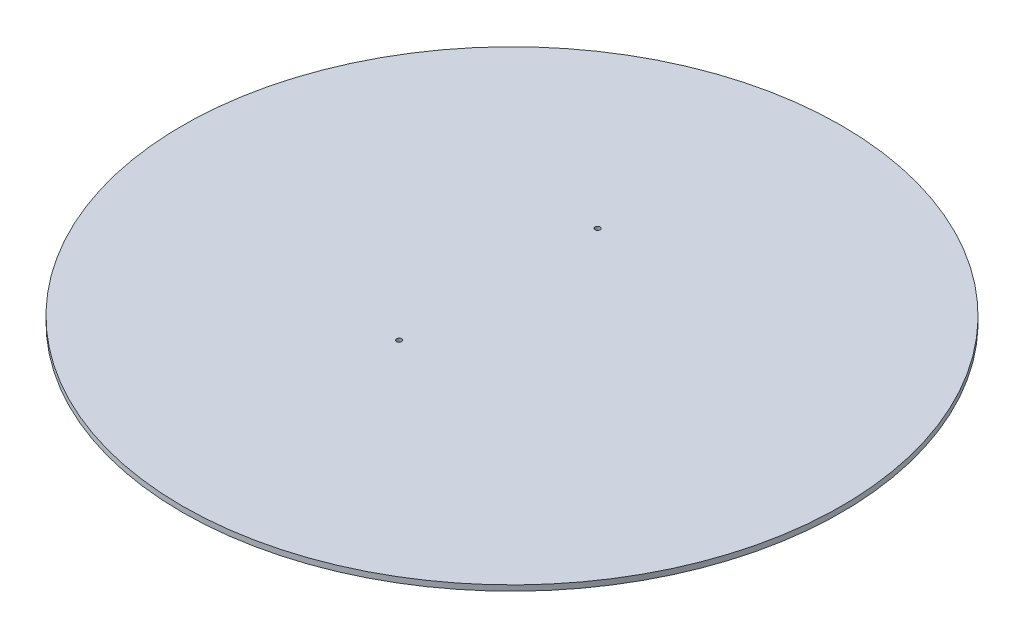
ISO-10303-21;
HEADER;
FILE_DESCRIPTION(('STEP AP214'),'2;1');
FILE_NAME('part.step','',(''),(''),'','','');
FILE_SCHEMA(('AUTOMOTIVE_DESIGN { 1 0 10303 214 1 1 1 1 }'));
ENDSEC;
DATA;
#1=APPLICATION_CONTEXT('core data for automotive mechanical design processes');
#2=APPLICATION_PROTOCOL_DEFINITION('international standard','automotive_design',2000,#1);
#3=PRODUCT_CONTEXT('',#1,'mechanical');
#4=PRODUCT('Part','Part','',(#3));
#5=PRODUCT_RELATED_PRODUCT_CATEGORY('part','',(#4));
#6=PRODUCT_DEFINITION_FORMATION('','',#4);
#7=PRODUCT_DEFINITION_CONTEXT('part definition',#1,'design');
#8=PRODUCT_DEFINITION('design','',#6,#7);
#9=PRODUCT_DEFINITION_SHAPE('','',#8);
#10=(LENGTH_UNIT() NAMED_UNIT(*) SI_UNIT(.MILLI.,.METRE.));
#11=(NAMED_UNIT(*) PLANE_ANGLE_UNIT() SI_UNIT($,.RADIAN.));
#12=(NAMED_UNIT(*) SI_UNIT($,.STERADIAN.) SOLID_ANGLE_UNIT());
#13=UNCERTAINTY_MEASURE_WITH_UNIT(LENGTH_MEASURE(1.E-05),#10,'distance_accuracy_value','');
#14=(GEOMETRIC_REPRESENTATION_CONTEXT(3) GLOBAL_UNCERTAINTY_ASSIGNED_CONTEXT((#13)) GLOBAL_UNIT_ASSIGNED_CONTEXT((#10,
#11,#12)) REPRESENTATION_CONTEXT('',''));
#15=CARTESIAN_POINT('',(0.,0.,0.));
#16=DIRECTION('',(0.,0.,1.));
#17=DIRECTION('',(1.,0.,0.));
#18=AXIS2_PLACEMENT_3D('',#15,#16,#17);
#19=CARTESIAN_POINT('',(0.,5.08,0.));
#20=DIRECTION('',(0.,-1.,0.));
#21=DIRECTION('',(0.,0.,-1.));
#22=AXIS2_PLACEMENT_3D('',#19,#20,#21);
#23=CYLINDRICAL_SURFACE('',#22,304.8);
#24=CARTESIAN_POINT('',(0.,5.08,0.));
#25=DIRECTION('',(0.,1.,0.));
#26=DIRECTION('',(0.,0.,1.));
#27=AXIS2_PLACEMENT_3D('',#24,#25,#26);
#28=CIRCLE('',#27,304.8);
#29=CARTESIAN_POINT('',(0.,5.08,304.8));
#30=VERTEX_POINT('',#29);
#31=EDGE_CURVE('E10',#30,#30,#28,.T.);
#32=ORIENTED_EDGE('',*,*,#31,.F.);
#33=EDGE_LOOP('',(#32));
#34=FACE_BOUND('',#33,.T.);
#35=CARTESIAN_POINT('',(0.,0.,0.));
#36=DIRECTION('',(0.,1.,0.));
#37=DIRECTION('',(0.,0.,1.));
#38=AXIS2_PLACEMENT_3D('',#35,#36,#37);
#39=CIRCLE('',#38,304.8);
#40=CARTESIAN_POINT('',(0.,0.,304.8));
#41=VERTEX_POINT('',#40);
#42=EDGE_CURVE('E44',#41,#41,#39,.T.);
#43=ORIENTED_EDGE('',*,*,#42,.T.);
#44=EDGE_LOOP('',(#43));
#45=FACE_BOUND('',#44,.T.);
#46=ADVANCED_FACE('F37',(#34,#45),#23,.T.);
#47=CARTESIAN_POINT('',(0.,5.08,0.));
#48=DIRECTION('',(0.,1.,0.));
#49=DIRECTION('',(0.,0.,1.));
#50=AXIS2_PLACEMENT_3D('',#47,#48,#49);
#51=PLANE('',#50);
#52=CARTESIAN_POINT('',(-32.706068379434,5.08,71.7460085753199));
#53=DIRECTION('',(0.,1.,0.));
#54=DIRECTION('',(0.959051401440909,0.,0.283232076916137));
#55=AXIS2_PLACEMENT_3D('',#52,#53,#54);
#56=ELLIPSE('',#55,2.3645262104519,2.34949999999998);
#57=CARTESIAN_POINT('',(-30.4383662035564,5.08,72.4157182448289));
#58=VERTEX_POINT('',#57);
#59=EDGE_CURVE('E49',#58,#58,#56,.T.);
#60=ORIENTED_EDGE('',*,*,#59,.F.);
#61=EDGE_LOOP('',(#60));
#62=FACE_BOUND('',#61,.T.);
#63=CARTESIAN_POINT('',(-30.4760806872812,5.08,-109.679755502596));
#64=DIRECTION('',(0.,1.,0.));
#65=DIRECTION('',(0.959051401440909,0.,0.283232076916137));
#66=AXIS2_PLACEMENT_3D('',#63,#64,#65);
#67=ELLIPSE('',#66,2.36452621045189,2.34949999999998);
#68=CARTESIAN_POINT('',(-28.2083785114035,5.08,-109.010045833088));
#69=VERTEX_POINT('',#68);
#70=EDGE_CURVE('E55',#69,#69,#67,.T.);
#71=ORIENTED_EDGE('',*,*,#70,.F.);
#72=EDGE_LOOP('',(#71));
#73=FACE_BOUND('',#72,.T.);
#74=ORIENTED_EDGE('',*,*,#31,.T.);
#75=EDGE_LOOP('',(#74));
#76=FACE_BOUND('',#75,.T.);
#77=ADVANCED_FACE('F70',(#62,#73,#76),#51,.T.);
#78=CARTESIAN_POINT('',(0.,0.,0.));
#79=DIRECTION('',(0.,1.,0.));
#80=DIRECTION('',(0.,0.,1.));
#81=AXIS2_PLACEMENT_3D('',#78,#79,#80);
#82=PLANE('',#81);
#83=CARTESIAN_POINT('',(-33.2579562856185,0.,71.5830221517991));
#84=DIRECTION('',(0.,1.,0.));
#85=DIRECTION('',(0.959051401440909,0.,0.283232076916137));
#86=AXIS2_PLACEMENT_3D('',#83,#84,#85);
#87=ELLIPSE('',#86,2.3645262104519,2.34949999999998);
#88=CARTESIAN_POINT('',(-30.9902541097408,0.,72.252731821308));
#89=VERTEX_POINT('',#88);
#90=EDGE_CURVE('E40',#89,#89,#87,.T.);
#91=ORIENTED_EDGE('',*,*,#90,.T.);
#92=EDGE_LOOP('',(#91));
#93=FACE_BOUND('',#92,.T.);
#94=CARTESIAN_POINT('',(-31.0279685934657,0.,-109.842741926117));
#95=DIRECTION('',(0.,1.,0.));
#96=DIRECTION('',(0.959051401440909,0.,0.283232076916137));
#97=AXIS2_PLACEMENT_3D('',#94,#95,#96);
#98=ELLIPSE('',#97,2.36452621045189,2.34949999999998);
#99=CARTESIAN_POINT('',(-28.760266417588,0.,-109.173032256608));
#100=VERTEX_POINT('',#99);
#101=EDGE_CURVE('E53',#100,#100,#98,.T.);
#102=ORIENTED_EDGE('',*,*,#101,.T.);
#103=EDGE_LOOP('',(#102));
#104=FACE_BOUND('',#103,.T.);
#105=ORIENTED_EDGE('',*,*,#42,.F.);
#106=EDGE_LOOP('',(#105));
#107=FACE_BOUND('',#106,.T.);
#108=ADVANCED_FACE('F73',(#93,#104,#107),#82,.F.);
#109=CARTESIAN_POINT('',(-34.8891578823114,-35.5413506393817,-110.983048545766));
#110=DIRECTION('',(0.10794896477867,0.99364514955026,0.0318800529870175));
#111=DIRECTION('',(-0.994150474320324,0.108003862934042,0.));
#112=AXIS2_PLACEMENT_3D('',#109,#110,#111);
#113=CYLINDRICAL_SURFACE('',#112,2.34949999999998);
#114=ORIENTED_EDGE('',*,*,#70,.T.);
#115=EDGE_LOOP('',(#114));
#116=FACE_BOUND('',#115,.T.);
#117=ORIENTED_EDGE('',*,*,#101,.F.);
#118=EDGE_LOOP('',(#117));
#119=FACE_BOUND('',#118,.T.);
#120=ADVANCED_FACE('F79',(#116,#119),#113,.F.);
#121=CARTESIAN_POINT('',(-37.7175215949751,-41.0492629348526,70.2659999955158));
#122=DIRECTION('',(0.10794896477867,0.99364514955026,0.0318800529870175));
#123=DIRECTION('',(-0.994150474320324,0.108003862934042,0.));
#124=AXIS2_PLACEMENT_3D('',#121,#122,#123);
#125=CYLINDRICAL_SURFACE('',#124,2.34949999999998);
#126=ORIENTED_EDGE('',*,*,#59,.T.);
#127=EDGE_LOOP('',(#126));
#128=FACE_BOUND('',#127,.T.);
#129=ORIENTED_EDGE('',*,*,#90,.F.);
#130=EDGE_LOOP('',(#129));
#131=FACE_BOUND('',#130,.T.);
#132=ADVANCED_FACE('F67',(#128,#131),#125,.F.);
#133=CLOSED_SHELL('',(#46,#77,#108,#120,#132));
#134=MANIFOLD_SOLID_BREP('B2',#133);
#135=ADVANCED_BREP_SHAPE_REPRESENTATION('',(#18,#134),#14);
#136=SHAPE_DEFINITION_REPRESENTATION(#9,#135);
ENDSEC;
END-ISO-10303-21;
